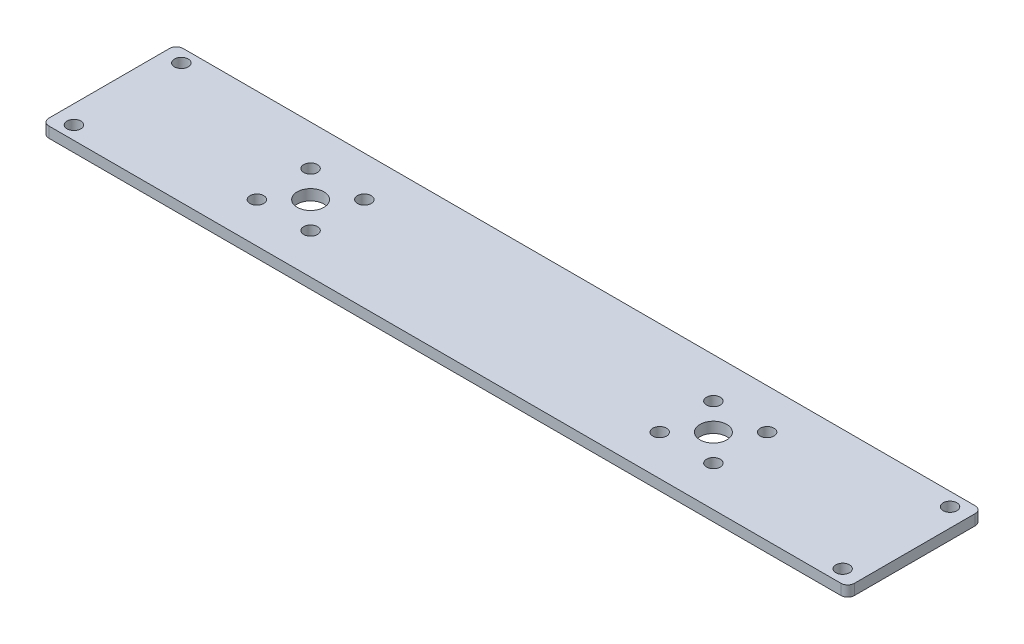
ISO-10303-21;
HEADER;
FILE_DESCRIPTION(('STEP AP214'),'2;1');
FILE_NAME('part.step','',(''),(''),'','','');
FILE_SCHEMA(('AUTOMOTIVE_DESIGN { 1 0 10303 214 1 1 1 1 }'));
ENDSEC;
DATA;
#1=APPLICATION_CONTEXT('core data for automotive mechanical design processes');
#2=APPLICATION_PROTOCOL_DEFINITION('international standard','automotive_design',2000,#1);
#3=PRODUCT_CONTEXT('',#1,'mechanical');
#4=PRODUCT('Part','Part','',(#3));
#5=PRODUCT_RELATED_PRODUCT_CATEGORY('part','',(#4));
#6=PRODUCT_DEFINITION_FORMATION('','',#4);
#7=PRODUCT_DEFINITION_CONTEXT('part definition',#1,'design');
#8=PRODUCT_DEFINITION('design','',#6,#7);
#9=PRODUCT_DEFINITION_SHAPE('','',#8);
#10=(LENGTH_UNIT() NAMED_UNIT(*) SI_UNIT(.MILLI.,.METRE.));
#11=(NAMED_UNIT(*) PLANE_ANGLE_UNIT() SI_UNIT($,.RADIAN.));
#12=(NAMED_UNIT(*) SI_UNIT($,.STERADIAN.) SOLID_ANGLE_UNIT());
#13=UNCERTAINTY_MEASURE_WITH_UNIT(LENGTH_MEASURE(1.E-05),#10,'distance_accuracy_value','');
#14=(GEOMETRIC_REPRESENTATION_CONTEXT(3) GLOBAL_UNCERTAINTY_ASSIGNED_CONTEXT((#13)) GLOBAL_UNIT_ASSIGNED_CONTEXT((#10,
#11,#12)) REPRESENTATION_CONTEXT('',''));
#15=CARTESIAN_POINT('',(0.,0.,0.));
#16=DIRECTION('',(0.,0.,1.));
#17=DIRECTION('',(1.,0.,0.));
#18=AXIS2_PLACEMENT_3D('',#15,#16,#17);
#19=CARTESIAN_POINT('',(0.,3.175,0.));
#20=DIRECTION('',(0.,-1.,0.));
#21=DIRECTION('',(0.,0.,-1.));
#22=AXIS2_PLACEMENT_3D('',#19,#20,#21);
#23=PLANE('',#22);
#24=DIRECTION('',(0.,0.,1.));
#25=VECTOR('',#24,1.);
#26=CARTESIAN_POINT('',(-120.,3.175,20.));
#27=LINE('',#26,#25);
#28=CARTESIAN_POINT('',(-120.,3.175,-18.));
#29=VERTEX_POINT('',#28);
#30=CARTESIAN_POINT('',(-120.,3.175,18.));
#31=VERTEX_POINT('',#30);
#32=EDGE_CURVE('E171',#29,#31,#27,.T.);
#33=ORIENTED_EDGE('',*,*,#32,.T.);
#34=CARTESIAN_POINT('',(-118.,3.175,18.));
#35=DIRECTION('',(0.,-1.,0.));
#36=DIRECTION('',(0.,0.,-1.));
#37=AXIS2_PLACEMENT_3D('',#34,#35,#36);
#38=CIRCLE('',#37,2.);
#39=CARTESIAN_POINT('',(-118.,3.175,20.));
#40=VERTEX_POINT('',#39);
#41=EDGE_CURVE('E148',#31,#40,#38,.F.);
#42=ORIENTED_EDGE('',*,*,#41,.T.);
#43=DIRECTION('',(1.,0.,0.));
#44=VECTOR('',#43,1.);
#45=CARTESIAN_POINT('',(-120.,3.175,20.));
#46=LINE('',#45,#44);
#47=CARTESIAN_POINT('',(118.,3.175,20.));
#48=VERTEX_POINT('',#47);
#49=EDGE_CURVE('E119',#40,#48,#46,.T.);
#50=ORIENTED_EDGE('',*,*,#49,.T.);
#51=CARTESIAN_POINT('',(118.,3.175,18.));
#52=DIRECTION('',(0.,-1.,0.));
#53=DIRECTION('',(0.,0.,-1.));
#54=AXIS2_PLACEMENT_3D('',#51,#52,#53);
#55=CIRCLE('',#54,2.);
#56=CARTESIAN_POINT('',(120.,3.175,18.));
#57=VERTEX_POINT('',#56);
#58=EDGE_CURVE('E143',#48,#57,#55,.F.);
#59=ORIENTED_EDGE('',*,*,#58,.T.);
#60=DIRECTION('',(0.,0.,-1.));
#61=VECTOR('',#60,1.);
#62=CARTESIAN_POINT('',(120.,3.175,20.));
#63=LINE('',#62,#61);
#64=CARTESIAN_POINT('',(120.,3.175,-18.));
#65=VERTEX_POINT('',#64);
#66=EDGE_CURVE('E126',#57,#65,#63,.T.);
#67=ORIENTED_EDGE('',*,*,#66,.T.);
#68=CARTESIAN_POINT('',(118.,3.175,-18.));
#69=DIRECTION('',(0.,-1.,0.));
#70=DIRECTION('',(0.,0.,-1.));
#71=AXIS2_PLACEMENT_3D('',#68,#69,#70);
#72=CIRCLE('',#71,2.);
#73=CARTESIAN_POINT('',(118.,3.175,-20.));
#74=VERTEX_POINT('',#73);
#75=EDGE_CURVE('E55',#65,#74,#72,.F.);
#76=ORIENTED_EDGE('',*,*,#75,.T.);
#77=DIRECTION('',(-1.,0.,0.));
#78=VECTOR('',#77,1.);
#79=CARTESIAN_POINT('',(-120.,3.175,-20.));
#80=LINE('',#79,#78);
#81=CARTESIAN_POINT('',(-118.,3.175,-20.));
#82=VERTEX_POINT('',#81);
#83=EDGE_CURVE('E129',#74,#82,#80,.T.);
#84=ORIENTED_EDGE('',*,*,#83,.T.);
#85=CARTESIAN_POINT('',(-118.,3.175,-18.));
#86=DIRECTION('',(0.,-1.,0.));
#87=DIRECTION('',(0.,0.,-1.));
#88=AXIS2_PLACEMENT_3D('',#85,#86,#87);
#89=CIRCLE('',#88,2.);
#90=EDGE_CURVE('E146',#82,#29,#89,.F.);
#91=ORIENTED_EDGE('',*,*,#90,.T.);
#92=EDGE_LOOP('',(#33,#42,#50,#59,#67,#76,#84,#91));
#93=FACE_BOUND('',#92,.T.);
#94=CARTESIAN_POINT('',(114.5,3.175,-16.));
#95=DIRECTION('',(0.,1.,0.));
#96=DIRECTION('',(0.,0.,1.));
#97=AXIS2_PLACEMENT_3D('',#94,#95,#96);
#98=CIRCLE('',#97,2.04999999999999);
#99=CARTESIAN_POINT('',(114.5,3.175,-13.95));
#100=VERTEX_POINT('',#99);
#101=EDGE_CURVE('E164',#100,#100,#98,.T.);
#102=ORIENTED_EDGE('',*,*,#101,.F.);
#103=EDGE_LOOP('',(#102));
#104=FACE_BOUND('',#103,.T.);
#105=CARTESIAN_POINT('',(114.5,3.175,16.));
#106=DIRECTION('',(0.,1.,0.));
#107=DIRECTION('',(0.,0.,1.));
#108=AXIS2_PLACEMENT_3D('',#105,#106,#107);
#109=CIRCLE('',#108,2.04999999999999);
#110=CARTESIAN_POINT('',(114.5,3.175,18.05));
#111=VERTEX_POINT('',#110);
#112=EDGE_CURVE('E176',#111,#111,#109,.T.);
#113=ORIENTED_EDGE('',*,*,#112,.F.);
#114=EDGE_LOOP('',(#113));
#115=FACE_BOUND('',#114,.T.);
#116=CARTESIAN_POINT('',(-114.5,3.175,-16.));
#117=DIRECTION('',(0.,1.,0.));
#118=DIRECTION('',(0.,0.,1.));
#119=AXIS2_PLACEMENT_3D('',#116,#117,#118);
#120=CIRCLE('',#119,2.04999999999999);
#121=CARTESIAN_POINT('',(-114.5,3.175,-13.95));
#122=VERTEX_POINT('',#121);
#123=EDGE_CURVE('E181',#122,#122,#120,.T.);
#124=ORIENTED_EDGE('',*,*,#123,.F.);
#125=EDGE_LOOP('',(#124));
#126=FACE_BOUND('',#125,.T.);
#127=CARTESIAN_POINT('',(-114.5,3.175,16.));
#128=DIRECTION('',(0.,1.,0.));
#129=DIRECTION('',(0.,0.,1.));
#130=AXIS2_PLACEMENT_3D('',#127,#128,#129);
#131=CIRCLE('',#130,2.04999999999999);
#132=CARTESIAN_POINT('',(-114.5,3.175,18.05));
#133=VERTEX_POINT('',#132);
#134=EDGE_CURVE('E187',#133,#133,#131,.T.);
#135=ORIENTED_EDGE('',*,*,#134,.F.);
#136=EDGE_LOOP('',(#135));
#137=FACE_BOUND('',#136,.T.);
#138=CARTESIAN_POINT('',(-52.,3.175,7.99999999999999));
#139=DIRECTION('',(0.,1.,0.));
#140=DIRECTION('',(0.,0.,1.));
#141=AXIS2_PLACEMENT_3D('',#138,#139,#140);
#142=CIRCLE('',#141,2.05);
#143=CARTESIAN_POINT('',(-52.,3.175,10.05));
#144=VERTEX_POINT('',#143);
#145=EDGE_CURVE('E193',#144,#144,#142,.T.);
#146=ORIENTED_EDGE('',*,*,#145,.F.);
#147=EDGE_LOOP('',(#146));
#148=FACE_BOUND('',#147,.T.);
#149=CARTESIAN_POINT('',(-68.,3.175,7.99999999999999));
#150=DIRECTION('',(0.,1.,0.));
#151=DIRECTION('',(0.,0.,1.));
#152=AXIS2_PLACEMENT_3D('',#149,#150,#151);
#153=CIRCLE('',#152,2.04999999999999);
#154=CARTESIAN_POINT('',(-68.,3.175,10.05));
#155=VERTEX_POINT('',#154);
#156=EDGE_CURVE('E199',#155,#155,#153,.T.);
#157=ORIENTED_EDGE('',*,*,#156,.F.);
#158=EDGE_LOOP('',(#157));
#159=FACE_BOUND('',#158,.T.);
#160=CARTESIAN_POINT('',(-68.,3.175,-8.00000000000001));
#161=DIRECTION('',(0.,1.,0.));
#162=DIRECTION('',(0.,0.,1.));
#163=AXIS2_PLACEMENT_3D('',#160,#161,#162);
#164=CIRCLE('',#163,2.04999999999999);
#165=CARTESIAN_POINT('',(-68.,3.175,-5.95000000000001));
#166=VERTEX_POINT('',#165);
#167=EDGE_CURVE('E205',#166,#166,#164,.T.);
#168=ORIENTED_EDGE('',*,*,#167,.F.);
#169=EDGE_LOOP('',(#168));
#170=FACE_BOUND('',#169,.T.);
#171=CARTESIAN_POINT('',(-52.,3.175,-8.00000000000001));
#172=DIRECTION('',(0.,1.,0.));
#173=DIRECTION('',(0.,0.,1.));
#174=AXIS2_PLACEMENT_3D('',#171,#172,#173);
#175=CIRCLE('',#174,2.05);
#176=CARTESIAN_POINT('',(-52.,3.175,-5.95));
#177=VERTEX_POINT('',#176);
#178=EDGE_CURVE('E211',#177,#177,#175,.T.);
#179=ORIENTED_EDGE('',*,*,#178,.F.);
#180=EDGE_LOOP('',(#179));
#181=FACE_BOUND('',#180,.T.);
#182=CARTESIAN_POINT('',(-60.,3.175,0.));
#183=DIRECTION('',(0.,1.,0.));
#184=DIRECTION('',(0.,0.,1.));
#185=AXIS2_PLACEMENT_3D('',#182,#183,#184);
#186=CIRCLE('',#185,4.00000000000001);
#187=CARTESIAN_POINT('',(-60.,3.175,4.));
#188=VERTEX_POINT('',#187);
#189=EDGE_CURVE('E217',#188,#188,#186,.T.);
#190=ORIENTED_EDGE('',*,*,#189,.F.);
#191=EDGE_LOOP('',(#190));
#192=FACE_BOUND('',#191,.T.);
#193=CARTESIAN_POINT('',(67.9999999999999,3.175,-8.00000000000002));
#194=DIRECTION('',(0.,1.,0.));
#195=DIRECTION('',(0.,0.,-1.));
#196=AXIS2_PLACEMENT_3D('',#193,#194,#195);
#197=CIRCLE('',#196,2.04999999999999);
#198=CARTESIAN_POINT('',(67.9999999999999,3.175,-10.05));
#199=VERTEX_POINT('',#198);
#200=EDGE_CURVE('E223',#199,#199,#197,.T.);
#201=ORIENTED_EDGE('',*,*,#200,.F.);
#202=EDGE_LOOP('',(#201));
#203=FACE_BOUND('',#202,.T.);
#204=CARTESIAN_POINT('',(51.9999999999999,3.175,-8.00000000000002));
#205=DIRECTION('',(0.,1.,0.));
#206=DIRECTION('',(0.,0.,-1.));
#207=AXIS2_PLACEMENT_3D('',#204,#205,#206);
#208=CIRCLE('',#207,2.05);
#209=CARTESIAN_POINT('',(51.9999999999999,3.175,-10.05));
#210=VERTEX_POINT('',#209);
#211=EDGE_CURVE('E229',#210,#210,#208,.T.);
#212=ORIENTED_EDGE('',*,*,#211,.F.);
#213=EDGE_LOOP('',(#212));
#214=FACE_BOUND('',#213,.T.);
#215=CARTESIAN_POINT('',(59.9999999999999,3.175,0.));
#216=DIRECTION('',(0.,1.,0.));
#217=DIRECTION('',(0.,0.,-1.));
#218=AXIS2_PLACEMENT_3D('',#215,#216,#217);
#219=CIRCLE('',#218,4.00000000000001);
#220=CARTESIAN_POINT('',(59.9999999999999,3.175,-4.00000000000003));
#221=VERTEX_POINT('',#220);
#222=EDGE_CURVE('E235',#221,#221,#219,.T.);
#223=ORIENTED_EDGE('',*,*,#222,.F.);
#224=EDGE_LOOP('',(#223));
#225=FACE_BOUND('',#224,.T.);
#226=CARTESIAN_POINT('',(67.9999999999999,3.175,7.99999999999998));
#227=DIRECTION('',(0.,1.,0.));
#228=DIRECTION('',(0.,0.,-1.));
#229=AXIS2_PLACEMENT_3D('',#226,#227,#228);
#230=CIRCLE('',#229,2.04999999999999);
#231=CARTESIAN_POINT('',(67.9999999999999,3.175,5.94999999999999));
#232=VERTEX_POINT('',#231);
#233=EDGE_CURVE('E241',#232,#232,#230,.T.);
#234=ORIENTED_EDGE('',*,*,#233,.F.);
#235=EDGE_LOOP('',(#234));
#236=FACE_BOUND('',#235,.T.);
#237=CARTESIAN_POINT('',(51.9999999999999,3.175,7.99999999999998));
#238=DIRECTION('',(0.,1.,0.));
#239=DIRECTION('',(0.,0.,-1.));
#240=AXIS2_PLACEMENT_3D('',#237,#238,#239);
#241=CIRCLE('',#240,2.05);
#242=CARTESIAN_POINT('',(51.9999999999999,3.175,5.94999999999998));
#243=VERTEX_POINT('',#242);
#244=EDGE_CURVE('E247',#243,#243,#241,.T.);
#245=ORIENTED_EDGE('',*,*,#244,.F.);
#246=EDGE_LOOP('',(#245));
#247=FACE_BOUND('',#246,.T.);
#248=ADVANCED_FACE('F33',(#93,#104,#115,#126,#137,#148,#159,#170,#181,#192,#203,#214,#225,#236,
#247),#23,.F.);
#249=CARTESIAN_POINT('',(0.,0.,0.));
#250=DIRECTION('',(0.,-1.,0.));
#251=DIRECTION('',(0.,0.,-1.));
#252=AXIS2_PLACEMENT_3D('',#249,#250,#251);
#253=PLANE('',#252);
#254=CARTESIAN_POINT('',(67.9999999999999,0.,7.99999999999998));
#255=DIRECTION('',(0.,1.,0.));
#256=DIRECTION('',(0.,0.,-1.));
#257=AXIS2_PLACEMENT_3D('',#254,#255,#256);
#258=CIRCLE('',#257,2.04999999999999);
#259=CARTESIAN_POINT('',(67.9999999999999,0.,5.94999999999999));
#260=VERTEX_POINT('',#259);
#261=EDGE_CURVE('E244',#260,#260,#258,.T.);
#262=ORIENTED_EDGE('',*,*,#261,.T.);
#263=EDGE_LOOP('',(#262));
#264=FACE_BOUND('',#263,.T.);
#265=CARTESIAN_POINT('',(51.9999999999999,0.,-8.00000000000002));
#266=DIRECTION('',(0.,1.,0.));
#267=DIRECTION('',(0.,0.,-1.));
#268=AXIS2_PLACEMENT_3D('',#265,#266,#267);
#269=CIRCLE('',#268,2.05);
#270=CARTESIAN_POINT('',(51.9999999999999,0.,-10.05));
#271=VERTEX_POINT('',#270);
#272=EDGE_CURVE('E232',#271,#271,#269,.T.);
#273=ORIENTED_EDGE('',*,*,#272,.T.);
#274=EDGE_LOOP('',(#273));
#275=FACE_BOUND('',#274,.T.);
#276=CARTESIAN_POINT('',(-60.,0.,0.));
#277=DIRECTION('',(0.,1.,0.));
#278=DIRECTION('',(0.,0.,1.));
#279=AXIS2_PLACEMENT_3D('',#276,#277,#278);
#280=CIRCLE('',#279,4.00000000000001);
#281=CARTESIAN_POINT('',(-60.,0.,4.));
#282=VERTEX_POINT('',#281);
#283=EDGE_CURVE('E220',#282,#282,#280,.T.);
#284=ORIENTED_EDGE('',*,*,#283,.T.);
#285=EDGE_LOOP('',(#284));
#286=FACE_BOUND('',#285,.T.);
#287=CARTESIAN_POINT('',(-68.,0.,-8.00000000000001));
#288=DIRECTION('',(0.,1.,0.));
#289=DIRECTION('',(0.,0.,1.));
#290=AXIS2_PLACEMENT_3D('',#287,#288,#289);
#291=CIRCLE('',#290,2.04999999999999);
#292=CARTESIAN_POINT('',(-68.,0.,-5.95000000000001));
#293=VERTEX_POINT('',#292);
#294=EDGE_CURVE('E208',#293,#293,#291,.T.);
#295=ORIENTED_EDGE('',*,*,#294,.T.);
#296=EDGE_LOOP('',(#295));
#297=FACE_BOUND('',#296,.T.);
#298=CARTESIAN_POINT('',(-52.,0.,7.99999999999999));
#299=DIRECTION('',(0.,1.,0.));
#300=DIRECTION('',(0.,0.,1.));
#301=AXIS2_PLACEMENT_3D('',#298,#299,#300);
#302=CIRCLE('',#301,2.05);
#303=CARTESIAN_POINT('',(-52.,0.,10.05));
#304=VERTEX_POINT('',#303);
#305=EDGE_CURVE('E196',#304,#304,#302,.T.);
#306=ORIENTED_EDGE('',*,*,#305,.T.);
#307=EDGE_LOOP('',(#306));
#308=FACE_BOUND('',#307,.T.);
#309=CARTESIAN_POINT('',(-114.5,0.,-16.));
#310=DIRECTION('',(0.,1.,0.));
#311=DIRECTION('',(0.,0.,1.));
#312=AXIS2_PLACEMENT_3D('',#309,#310,#311);
#313=CIRCLE('',#312,2.04999999999999);
#314=CARTESIAN_POINT('',(-114.5,0.,-13.95));
#315=VERTEX_POINT('',#314);
#316=EDGE_CURVE('E184',#315,#315,#313,.T.);
#317=ORIENTED_EDGE('',*,*,#316,.T.);
#318=EDGE_LOOP('',(#317));
#319=FACE_BOUND('',#318,.T.);
#320=CARTESIAN_POINT('',(114.5,0.,-16.));
#321=DIRECTION('',(0.,1.,0.));
#322=DIRECTION('',(0.,0.,1.));
#323=AXIS2_PLACEMENT_3D('',#320,#321,#322);
#324=CIRCLE('',#323,2.04999999999999);
#325=CARTESIAN_POINT('',(114.5,0.,-13.95));
#326=VERTEX_POINT('',#325);
#327=EDGE_CURVE('E167',#326,#326,#324,.T.);
#328=ORIENTED_EDGE('',*,*,#327,.T.);
#329=EDGE_LOOP('',(#328));
#330=FACE_BOUND('',#329,.T.);
#331=DIRECTION('',(1.,0.,0.));
#332=VECTOR('',#331,1.);
#333=CARTESIAN_POINT('',(-120.,0.,20.));
#334=LINE('',#333,#332);
#335=CARTESIAN_POINT('',(-118.,0.,20.));
#336=VERTEX_POINT('',#335);
#337=CARTESIAN_POINT('',(118.,0.,20.));
#338=VERTEX_POINT('',#337);
#339=EDGE_CURVE('E116',#336,#338,#334,.T.);
#340=ORIENTED_EDGE('',*,*,#339,.F.);
#341=CARTESIAN_POINT('',(-118.,0.,18.));
#342=DIRECTION('',(0.,-1.,0.));
#343=DIRECTION('',(0.,0.,-1.));
#344=AXIS2_PLACEMENT_3D('',#341,#342,#343);
#345=CIRCLE('',#344,2.);
#346=CARTESIAN_POINT('',(-120.,0.,18.));
#347=VERTEX_POINT('',#346);
#348=EDGE_CURVE('E99',#336,#347,#345,.T.);
#349=ORIENTED_EDGE('',*,*,#348,.T.);
#350=DIRECTION('',(0.,0.,1.));
#351=VECTOR('',#350,1.);
#352=CARTESIAN_POINT('',(-120.,0.,20.));
#353=LINE('',#352,#351);
#354=CARTESIAN_POINT('',(-120.,0.,-18.));
#355=VERTEX_POINT('',#354);
#356=EDGE_CURVE('E127',#355,#347,#353,.T.);
#357=ORIENTED_EDGE('',*,*,#356,.F.);
#358=CARTESIAN_POINT('',(-118.,0.,-18.));
#359=DIRECTION('',(0.,-1.,0.));
#360=DIRECTION('',(0.,0.,-1.));
#361=AXIS2_PLACEMENT_3D('',#358,#359,#360);
#362=CIRCLE('',#361,2.);
#363=CARTESIAN_POINT('',(-118.,0.,-20.));
#364=VERTEX_POINT('',#363);
#365=EDGE_CURVE('E110',#355,#364,#362,.T.);
#366=ORIENTED_EDGE('',*,*,#365,.T.);
#367=DIRECTION('',(-1.,0.,0.));
#368=VECTOR('',#367,1.);
#369=CARTESIAN_POINT('',(-120.,0.,-20.));
#370=LINE('',#369,#368);
#371=CARTESIAN_POINT('',(118.,0.,-20.));
#372=VERTEX_POINT('',#371);
#373=EDGE_CURVE('E131',#372,#364,#370,.T.);
#374=ORIENTED_EDGE('',*,*,#373,.F.);
#375=CARTESIAN_POINT('',(118.,0.,-18.));
#376=DIRECTION('',(0.,-1.,0.));
#377=DIRECTION('',(0.,0.,-1.));
#378=AXIS2_PLACEMENT_3D('',#375,#376,#377);
#379=CIRCLE('',#378,2.);
#380=CARTESIAN_POINT('',(120.,0.,-18.));
#381=VERTEX_POINT('',#380);
#382=EDGE_CURVE('E137',#372,#381,#379,.T.);
#383=ORIENTED_EDGE('',*,*,#382,.T.);
#384=DIRECTION('',(0.,0.,-1.));
#385=VECTOR('',#384,1.);
#386=CARTESIAN_POINT('',(120.,0.,20.));
#387=LINE('',#386,#385);
#388=CARTESIAN_POINT('',(120.,0.,18.));
#389=VERTEX_POINT('',#388);
#390=EDGE_CURVE('E159',#389,#381,#387,.T.);
#391=ORIENTED_EDGE('',*,*,#390,.F.);
#392=CARTESIAN_POINT('',(118.,0.,18.));
#393=DIRECTION('',(0.,-1.,0.));
#394=DIRECTION('',(0.,0.,-1.));
#395=AXIS2_PLACEMENT_3D('',#392,#393,#394);
#396=CIRCLE('',#395,2.);
#397=EDGE_CURVE('E120',#389,#338,#396,.T.);
#398=ORIENTED_EDGE('',*,*,#397,.T.);
#399=EDGE_LOOP('',(#340,#349,#357,#366,#374,#383,#391,#398));
#400=FACE_BOUND('',#399,.T.);
#401=CARTESIAN_POINT('',(114.5,0.,16.));
#402=DIRECTION('',(0.,1.,0.));
#403=DIRECTION('',(0.,0.,1.));
#404=AXIS2_PLACEMENT_3D('',#401,#402,#403);
#405=CIRCLE('',#404,2.04999999999999);
#406=CARTESIAN_POINT('',(114.5,0.,18.05));
#407=VERTEX_POINT('',#406);
#408=EDGE_CURVE('E178',#407,#407,#405,.T.);
#409=ORIENTED_EDGE('',*,*,#408,.T.);
#410=EDGE_LOOP('',(#409));
#411=FACE_BOUND('',#410,.T.);
#412=CARTESIAN_POINT('',(-114.5,0.,16.));
#413=DIRECTION('',(0.,1.,0.));
#414=DIRECTION('',(0.,0.,1.));
#415=AXIS2_PLACEMENT_3D('',#412,#413,#414);
#416=CIRCLE('',#415,2.04999999999999);
#417=CARTESIAN_POINT('',(-114.5,0.,18.05));
#418=VERTEX_POINT('',#417);
#419=EDGE_CURVE('E190',#418,#418,#416,.T.);
#420=ORIENTED_EDGE('',*,*,#419,.T.);
#421=EDGE_LOOP('',(#420));
#422=FACE_BOUND('',#421,.T.);
#423=CARTESIAN_POINT('',(-68.,0.,7.99999999999999));
#424=DIRECTION('',(0.,1.,0.));
#425=DIRECTION('',(0.,0.,1.));
#426=AXIS2_PLACEMENT_3D('',#423,#424,#425);
#427=CIRCLE('',#426,2.04999999999999);
#428=CARTESIAN_POINT('',(-68.,0.,10.05));
#429=VERTEX_POINT('',#428);
#430=EDGE_CURVE('E202',#429,#429,#427,.T.);
#431=ORIENTED_EDGE('',*,*,#430,.T.);
#432=EDGE_LOOP('',(#431));
#433=FACE_BOUND('',#432,.T.);
#434=CARTESIAN_POINT('',(-52.,0.,-8.00000000000001));
#435=DIRECTION('',(0.,1.,0.));
#436=DIRECTION('',(0.,0.,1.));
#437=AXIS2_PLACEMENT_3D('',#434,#435,#436);
#438=CIRCLE('',#437,2.05);
#439=CARTESIAN_POINT('',(-52.,0.,-5.95));
#440=VERTEX_POINT('',#439);
#441=EDGE_CURVE('E214',#440,#440,#438,.T.);
#442=ORIENTED_EDGE('',*,*,#441,.T.);
#443=EDGE_LOOP('',(#442));
#444=FACE_BOUND('',#443,.T.);
#445=CARTESIAN_POINT('',(67.9999999999999,0.,-8.00000000000002));
#446=DIRECTION('',(0.,1.,0.));
#447=DIRECTION('',(0.,0.,-1.));
#448=AXIS2_PLACEMENT_3D('',#445,#446,#447);
#449=CIRCLE('',#448,2.04999999999999);
#450=CARTESIAN_POINT('',(67.9999999999999,0.,-10.05));
#451=VERTEX_POINT('',#450);
#452=EDGE_CURVE('E226',#451,#451,#449,.T.);
#453=ORIENTED_EDGE('',*,*,#452,.T.);
#454=EDGE_LOOP('',(#453));
#455=FACE_BOUND('',#454,.T.);
#456=CARTESIAN_POINT('',(59.9999999999999,0.,0.));
#457=DIRECTION('',(0.,1.,0.));
#458=DIRECTION('',(0.,0.,-1.));
#459=AXIS2_PLACEMENT_3D('',#456,#457,#458);
#460=CIRCLE('',#459,4.00000000000001);
#461=CARTESIAN_POINT('',(59.9999999999999,0.,-4.00000000000003));
#462=VERTEX_POINT('',#461);
#463=EDGE_CURVE('E238',#462,#462,#460,.T.);
#464=ORIENTED_EDGE('',*,*,#463,.T.);
#465=EDGE_LOOP('',(#464));
#466=FACE_BOUND('',#465,.T.);
#467=CARTESIAN_POINT('',(51.9999999999999,0.,7.99999999999998));
#468=DIRECTION('',(0.,1.,0.));
#469=DIRECTION('',(0.,0.,-1.));
#470=AXIS2_PLACEMENT_3D('',#467,#468,#469);
#471=CIRCLE('',#470,2.05);
#472=CARTESIAN_POINT('',(51.9999999999999,0.,5.94999999999998));
#473=VERTEX_POINT('',#472);
#474=EDGE_CURVE('E250',#473,#473,#471,.T.);
#475=ORIENTED_EDGE('',*,*,#474,.T.);
#476=EDGE_LOOP('',(#475));
#477=FACE_BOUND('',#476,.T.);
#478=ADVANCED_FACE('F123',(#264,#275,#286,#297,#308,#319,#330,#400,#411,#422,#433,#444,#455,
#466,#477),#253,.T.);
#479=CARTESIAN_POINT('',(120.,3.175,20.));
#480=DIRECTION('',(-1.,0.,0.));
#481=DIRECTION('',(0.,0.,1.));
#482=AXIS2_PLACEMENT_3D('',#479,#480,#481);
#483=PLANE('',#482);
#484=ORIENTED_EDGE('',*,*,#390,.T.);
#485=DIRECTION('',(0.,-1.,0.));
#486=VECTOR('',#485,1.);
#487=CARTESIAN_POINT('',(120.,3.175,-18.));
#488=LINE('',#487,#486);
#489=EDGE_CURVE('E11',#381,#65,#488,.F.);
#490=ORIENTED_EDGE('',*,*,#489,.T.);
#491=ORIENTED_EDGE('',*,*,#66,.F.);
#492=DIRECTION('',(0.,-1.,0.));
#493=VECTOR('',#492,1.);
#494=CARTESIAN_POINT('',(120.,3.175,18.));
#495=LINE('',#494,#493);
#496=EDGE_CURVE('E41',#57,#389,#495,.T.);
#497=ORIENTED_EDGE('',*,*,#496,.T.);
#498=EDGE_LOOP('',(#484,#490,#491,#497));
#499=FACE_BOUND('',#498,.T.);
#500=ADVANCED_FACE('F158',(#499),#483,.F.);
#501=CARTESIAN_POINT('',(-120.,3.175,-20.));
#502=DIRECTION('',(0.,0.,1.));
#503=DIRECTION('',(1.,0.,0.));
#504=AXIS2_PLACEMENT_3D('',#501,#502,#503);
#505=PLANE('',#504);
#506=ORIENTED_EDGE('',*,*,#373,.T.);
#507=DIRECTION('',(0.,-1.,0.));
#508=VECTOR('',#507,1.);
#509=CARTESIAN_POINT('',(-118.,3.175,-20.));
#510=LINE('',#509,#508);
#511=EDGE_CURVE('E48',#364,#82,#510,.F.);
#512=ORIENTED_EDGE('',*,*,#511,.T.);
#513=ORIENTED_EDGE('',*,*,#83,.F.);
#514=DIRECTION('',(0.,-1.,0.));
#515=VECTOR('',#514,1.);
#516=CARTESIAN_POINT('',(118.,3.175,-20.));
#517=LINE('',#516,#515);
#518=EDGE_CURVE('E150',#74,#372,#517,.T.);
#519=ORIENTED_EDGE('',*,*,#518,.T.);
#520=EDGE_LOOP('',(#506,#512,#513,#519));
#521=FACE_BOUND('',#520,.T.);
#522=ADVANCED_FACE('F276',(#521),#505,.F.);
#523=CARTESIAN_POINT('',(-120.,3.175,20.));
#524=DIRECTION('',(1.,0.,0.));
#525=DIRECTION('',(0.,0.,-1.));
#526=AXIS2_PLACEMENT_3D('',#523,#524,#525);
#527=PLANE('',#526);
#528=ORIENTED_EDGE('',*,*,#356,.T.);
#529=DIRECTION('',(0.,-1.,0.));
#530=VECTOR('',#529,1.);
#531=CARTESIAN_POINT('',(-120.,3.175,18.));
#532=LINE('',#531,#530);
#533=EDGE_CURVE('E104',#347,#31,#532,.F.);
#534=ORIENTED_EDGE('',*,*,#533,.T.);
#535=ORIENTED_EDGE('',*,*,#32,.F.);
#536=DIRECTION('',(0.,-1.,0.));
#537=VECTOR('',#536,1.);
#538=CARTESIAN_POINT('',(-120.,3.175,-18.));
#539=LINE('',#538,#537);
#540=EDGE_CURVE('E109',#29,#355,#539,.T.);
#541=ORIENTED_EDGE('',*,*,#540,.T.);
#542=EDGE_LOOP('',(#528,#534,#535,#541));
#543=FACE_BOUND('',#542,.T.);
#544=ADVANCED_FACE('F273',(#543),#527,.F.);
#545=CARTESIAN_POINT('',(-120.,3.175,20.));
#546=DIRECTION('',(0.,0.,-1.));
#547=DIRECTION('',(-1.,0.,0.));
#548=AXIS2_PLACEMENT_3D('',#545,#546,#547);
#549=PLANE('',#548);
#550=ORIENTED_EDGE('',*,*,#49,.F.);
#551=DIRECTION('',(0.,-1.,0.));
#552=VECTOR('',#551,1.);
#553=CARTESIAN_POINT('',(-118.,3.175,20.));
#554=LINE('',#553,#552);
#555=EDGE_CURVE('E103',#40,#336,#554,.T.);
#556=ORIENTED_EDGE('',*,*,#555,.T.);
#557=ORIENTED_EDGE('',*,*,#339,.T.);
#558=DIRECTION('',(0.,-1.,0.));
#559=VECTOR('',#558,1.);
#560=CARTESIAN_POINT('',(118.,3.175,20.));
#561=LINE('',#560,#559);
#562=EDGE_CURVE('E121',#338,#48,#561,.F.);
#563=ORIENTED_EDGE('',*,*,#562,.T.);
#564=EDGE_LOOP('',(#550,#556,#557,#563));
#565=FACE_BOUND('',#564,.T.);
#566=ADVANCED_FACE('F115',(#565),#549,.F.);
#567=CARTESIAN_POINT('',(114.5,3.175,-16.));
#568=DIRECTION('',(0.,-1.,0.));
#569=DIRECTION('',(0.,0.,-1.));
#570=AXIS2_PLACEMENT_3D('',#567,#568,#569);
#571=CYLINDRICAL_SURFACE('',#570,2.04999999999999);
#572=ORIENTED_EDGE('',*,*,#101,.T.);
#573=EDGE_LOOP('',(#572));
#574=FACE_BOUND('',#573,.T.);
#575=ORIENTED_EDGE('',*,*,#327,.F.);
#576=EDGE_LOOP('',(#575));
#577=FACE_BOUND('',#576,.T.);
#578=ADVANCED_FACE('F268',(#574,#577),#571,.F.);
#579=CARTESIAN_POINT('',(114.5,3.175,16.));
#580=DIRECTION('',(0.,-1.,0.));
#581=DIRECTION('',(0.,0.,-1.));
#582=AXIS2_PLACEMENT_3D('',#579,#580,#581);
#583=CYLINDRICAL_SURFACE('',#582,2.04999999999999);
#584=ORIENTED_EDGE('',*,*,#112,.T.);
#585=EDGE_LOOP('',(#584));
#586=FACE_BOUND('',#585,.T.);
#587=ORIENTED_EDGE('',*,*,#408,.F.);
#588=EDGE_LOOP('',(#587));
#589=FACE_BOUND('',#588,.T.);
#590=ADVANCED_FACE('F469',(#586,#589),#583,.F.);
#591=CARTESIAN_POINT('',(-114.5,3.175,-16.));
#592=DIRECTION('',(0.,-1.,0.));
#593=DIRECTION('',(0.,0.,-1.));
#594=AXIS2_PLACEMENT_3D('',#591,#592,#593);
#595=CYLINDRICAL_SURFACE('',#594,2.04999999999999);
#596=ORIENTED_EDGE('',*,*,#123,.T.);
#597=EDGE_LOOP('',(#596));
#598=FACE_BOUND('',#597,.T.);
#599=ORIENTED_EDGE('',*,*,#316,.F.);
#600=EDGE_LOOP('',(#599));
#601=FACE_BOUND('',#600,.T.);
#602=ADVANCED_FACE('F459',(#598,#601),#595,.F.);
#603=CARTESIAN_POINT('',(-114.5,3.175,16.));
#604=DIRECTION('',(0.,-1.,0.));
#605=DIRECTION('',(0.,0.,-1.));
#606=AXIS2_PLACEMENT_3D('',#603,#604,#605);
#607=CYLINDRICAL_SURFACE('',#606,2.04999999999999);
#608=ORIENTED_EDGE('',*,*,#134,.T.);
#609=EDGE_LOOP('',(#608));
#610=FACE_BOUND('',#609,.T.);
#611=ORIENTED_EDGE('',*,*,#419,.F.);
#612=EDGE_LOOP('',(#611));
#613=FACE_BOUND('',#612,.T.);
#614=ADVANCED_FACE('F449',(#610,#613),#607,.F.);
#615=CARTESIAN_POINT('',(-52.,3.175,7.99999999999999));
#616=DIRECTION('',(0.,-1.,0.));
#617=DIRECTION('',(0.,0.,-1.));
#618=AXIS2_PLACEMENT_3D('',#615,#616,#617);
#619=CYLINDRICAL_SURFACE('',#618,2.05);
#620=ORIENTED_EDGE('',*,*,#145,.T.);
#621=EDGE_LOOP('',(#620));
#622=FACE_BOUND('',#621,.T.);
#623=ORIENTED_EDGE('',*,*,#305,.F.);
#624=EDGE_LOOP('',(#623));
#625=FACE_BOUND('',#624,.T.);
#626=ADVANCED_FACE('F439',(#622,#625),#619,.F.);
#627=CARTESIAN_POINT('',(-68.,3.175,7.99999999999999));
#628=DIRECTION('',(0.,-1.,0.));
#629=DIRECTION('',(0.,0.,-1.));
#630=AXIS2_PLACEMENT_3D('',#627,#628,#629);
#631=CYLINDRICAL_SURFACE('',#630,2.04999999999999);
#632=ORIENTED_EDGE('',*,*,#156,.T.);
#633=EDGE_LOOP('',(#632));
#634=FACE_BOUND('',#633,.T.);
#635=ORIENTED_EDGE('',*,*,#430,.F.);
#636=EDGE_LOOP('',(#635));
#637=FACE_BOUND('',#636,.T.);
#638=ADVANCED_FACE('F429',(#634,#637),#631,.F.);
#639=CARTESIAN_POINT('',(-68.,3.175,-8.00000000000001));
#640=DIRECTION('',(0.,-1.,0.));
#641=DIRECTION('',(0.,0.,-1.));
#642=AXIS2_PLACEMENT_3D('',#639,#640,#641);
#643=CYLINDRICAL_SURFACE('',#642,2.04999999999999);
#644=ORIENTED_EDGE('',*,*,#167,.T.);
#645=EDGE_LOOP('',(#644));
#646=FACE_BOUND('',#645,.T.);
#647=ORIENTED_EDGE('',*,*,#294,.F.);
#648=EDGE_LOOP('',(#647));
#649=FACE_BOUND('',#648,.T.);
#650=ADVANCED_FACE('F419',(#646,#649),#643,.F.);
#651=CARTESIAN_POINT('',(-52.,3.175,-8.00000000000001));
#652=DIRECTION('',(0.,-1.,0.));
#653=DIRECTION('',(0.,0.,-1.));
#654=AXIS2_PLACEMENT_3D('',#651,#652,#653);
#655=CYLINDRICAL_SURFACE('',#654,2.05);
#656=ORIENTED_EDGE('',*,*,#178,.T.);
#657=EDGE_LOOP('',(#656));
#658=FACE_BOUND('',#657,.T.);
#659=ORIENTED_EDGE('',*,*,#441,.F.);
#660=EDGE_LOOP('',(#659));
#661=FACE_BOUND('',#660,.T.);
#662=ADVANCED_FACE('F409',(#658,#661),#655,.F.);
#663=CARTESIAN_POINT('',(-60.,3.175,0.));
#664=DIRECTION('',(0.,-1.,0.));
#665=DIRECTION('',(0.,0.,-1.));
#666=AXIS2_PLACEMENT_3D('',#663,#664,#665);
#667=CYLINDRICAL_SURFACE('',#666,4.00000000000001);
#668=ORIENTED_EDGE('',*,*,#189,.T.);
#669=EDGE_LOOP('',(#668));
#670=FACE_BOUND('',#669,.T.);
#671=ORIENTED_EDGE('',*,*,#283,.F.);
#672=EDGE_LOOP('',(#671));
#673=FACE_BOUND('',#672,.T.);
#674=ADVANCED_FACE('F399',(#670,#673),#667,.F.);
#675=CARTESIAN_POINT('',(67.9999999999999,3.175,-8.00000000000002));
#676=DIRECTION('',(0.,-1.,0.));
#677=DIRECTION('',(0.,0.,-1.));
#678=AXIS2_PLACEMENT_3D('',#675,#676,#677);
#679=CYLINDRICAL_SURFACE('',#678,2.04999999999999);
#680=ORIENTED_EDGE('',*,*,#200,.T.);
#681=EDGE_LOOP('',(#680));
#682=FACE_BOUND('',#681,.T.);
#683=ORIENTED_EDGE('',*,*,#452,.F.);
#684=EDGE_LOOP('',(#683));
#685=FACE_BOUND('',#684,.T.);
#686=ADVANCED_FACE('F389',(#682,#685),#679,.F.);
#687=CARTESIAN_POINT('',(51.9999999999999,3.175,-8.00000000000002));
#688=DIRECTION('',(0.,-1.,0.));
#689=DIRECTION('',(0.,0.,-1.));
#690=AXIS2_PLACEMENT_3D('',#687,#688,#689);
#691=CYLINDRICAL_SURFACE('',#690,2.05);
#692=ORIENTED_EDGE('',*,*,#211,.T.);
#693=EDGE_LOOP('',(#692));
#694=FACE_BOUND('',#693,.T.);
#695=ORIENTED_EDGE('',*,*,#272,.F.);
#696=EDGE_LOOP('',(#695));
#697=FACE_BOUND('',#696,.T.);
#698=ADVANCED_FACE('F379',(#694,#697),#691,.F.);
#699=CARTESIAN_POINT('',(59.9999999999999,3.175,0.));
#700=DIRECTION('',(0.,-1.,0.));
#701=DIRECTION('',(0.,0.,-1.));
#702=AXIS2_PLACEMENT_3D('',#699,#700,#701);
#703=CYLINDRICAL_SURFACE('',#702,4.00000000000001);
#704=ORIENTED_EDGE('',*,*,#222,.T.);
#705=EDGE_LOOP('',(#704));
#706=FACE_BOUND('',#705,.T.);
#707=ORIENTED_EDGE('',*,*,#463,.F.);
#708=EDGE_LOOP('',(#707));
#709=FACE_BOUND('',#708,.T.);
#710=ADVANCED_FACE('F369',(#706,#709),#703,.F.);
#711=CARTESIAN_POINT('',(67.9999999999999,3.175,7.99999999999998));
#712=DIRECTION('',(0.,-1.,0.));
#713=DIRECTION('',(0.,0.,-1.));
#714=AXIS2_PLACEMENT_3D('',#711,#712,#713);
#715=CYLINDRICAL_SURFACE('',#714,2.04999999999999);
#716=ORIENTED_EDGE('',*,*,#233,.T.);
#717=EDGE_LOOP('',(#716));
#718=FACE_BOUND('',#717,.T.);
#719=ORIENTED_EDGE('',*,*,#261,.F.);
#720=EDGE_LOOP('',(#719));
#721=FACE_BOUND('',#720,.T.);
#722=ADVANCED_FACE('F360',(#718,#721),#715,.F.);
#723=CARTESIAN_POINT('',(51.9999999999999,3.175,7.99999999999998));
#724=DIRECTION('',(0.,-1.,0.));
#725=DIRECTION('',(0.,0.,-1.));
#726=AXIS2_PLACEMENT_3D('',#723,#724,#725);
#727=CYLINDRICAL_SURFACE('',#726,2.05);
#728=ORIENTED_EDGE('',*,*,#244,.T.);
#729=EDGE_LOOP('',(#728));
#730=FACE_BOUND('',#729,.T.);
#731=ORIENTED_EDGE('',*,*,#474,.F.);
#732=EDGE_LOOP('',(#731));
#733=FACE_BOUND('',#732,.T.);
#734=ADVANCED_FACE('F256',(#730,#733),#727,.F.);
#735=CARTESIAN_POINT('',(-118.,3.175,18.));
#736=DIRECTION('',(0.,-1.,0.));
#737=DIRECTION('',(0.,0.,-1.));
#738=AXIS2_PLACEMENT_3D('',#735,#736,#737);
#739=CYLINDRICAL_SURFACE('',#738,2.);
#740=ORIENTED_EDGE('',*,*,#41,.F.);
#741=ORIENTED_EDGE('',*,*,#533,.F.);
#742=ORIENTED_EDGE('',*,*,#348,.F.);
#743=ORIENTED_EDGE('',*,*,#555,.F.);
#744=EDGE_LOOP('',(#740,#741,#742,#743));
#745=FACE_BOUND('',#744,.T.);
#746=ADVANCED_FACE('F102',(#745),#739,.T.);
#747=CARTESIAN_POINT('',(-118.,3.175,-18.));
#748=DIRECTION('',(0.,-1.,0.));
#749=DIRECTION('',(0.,0.,-1.));
#750=AXIS2_PLACEMENT_3D('',#747,#748,#749);
#751=CYLINDRICAL_SURFACE('',#750,2.);
#752=ORIENTED_EDGE('',*,*,#90,.F.);
#753=ORIENTED_EDGE('',*,*,#511,.F.);
#754=ORIENTED_EDGE('',*,*,#365,.F.);
#755=ORIENTED_EDGE('',*,*,#540,.F.);
#756=EDGE_LOOP('',(#752,#753,#754,#755));
#757=FACE_BOUND('',#756,.T.);
#758=ADVANCED_FACE('F284',(#757),#751,.T.);
#759=CARTESIAN_POINT('',(118.,3.175,-18.));
#760=DIRECTION('',(0.,-1.,0.));
#761=DIRECTION('',(0.,0.,-1.));
#762=AXIS2_PLACEMENT_3D('',#759,#760,#761);
#763=CYLINDRICAL_SURFACE('',#762,2.);
#764=ORIENTED_EDGE('',*,*,#75,.F.);
#765=ORIENTED_EDGE('',*,*,#489,.F.);
#766=ORIENTED_EDGE('',*,*,#382,.F.);
#767=ORIENTED_EDGE('',*,*,#518,.F.);
#768=EDGE_LOOP('',(#764,#765,#766,#767));
#769=FACE_BOUND('',#768,.T.);
#770=ADVANCED_FACE('F286',(#769),#763,.T.);
#771=CARTESIAN_POINT('',(118.,3.175,18.));
#772=DIRECTION('',(0.,-1.,0.));
#773=DIRECTION('',(0.,0.,-1.));
#774=AXIS2_PLACEMENT_3D('',#771,#772,#773);
#775=CYLINDRICAL_SURFACE('',#774,2.);
#776=ORIENTED_EDGE('',*,*,#58,.F.);
#777=ORIENTED_EDGE('',*,*,#562,.F.);
#778=ORIENTED_EDGE('',*,*,#397,.F.);
#779=ORIENTED_EDGE('',*,*,#496,.F.);
#780=EDGE_LOOP('',(#776,#777,#778,#779));
#781=FACE_BOUND('',#780,.T.);
#782=ADVANCED_FACE('F35',(#781),#775,.T.);
#783=CLOSED_SHELL('',(#248,#478,#500,#522,#544,#566,#578,#590,#602,#614,#626,#638,#650,#662,
#674,#686,#698,#710,#722,#734,#746,#758,#770,#782));
#784=MANIFOLD_SOLID_BREP('B2',#783);
#785=ADVANCED_BREP_SHAPE_REPRESENTATION('',(#18,#784),#14);
#786=SHAPE_DEFINITION_REPRESENTATION(#9,#785);
ENDSEC;
END-ISO-10303-21;
